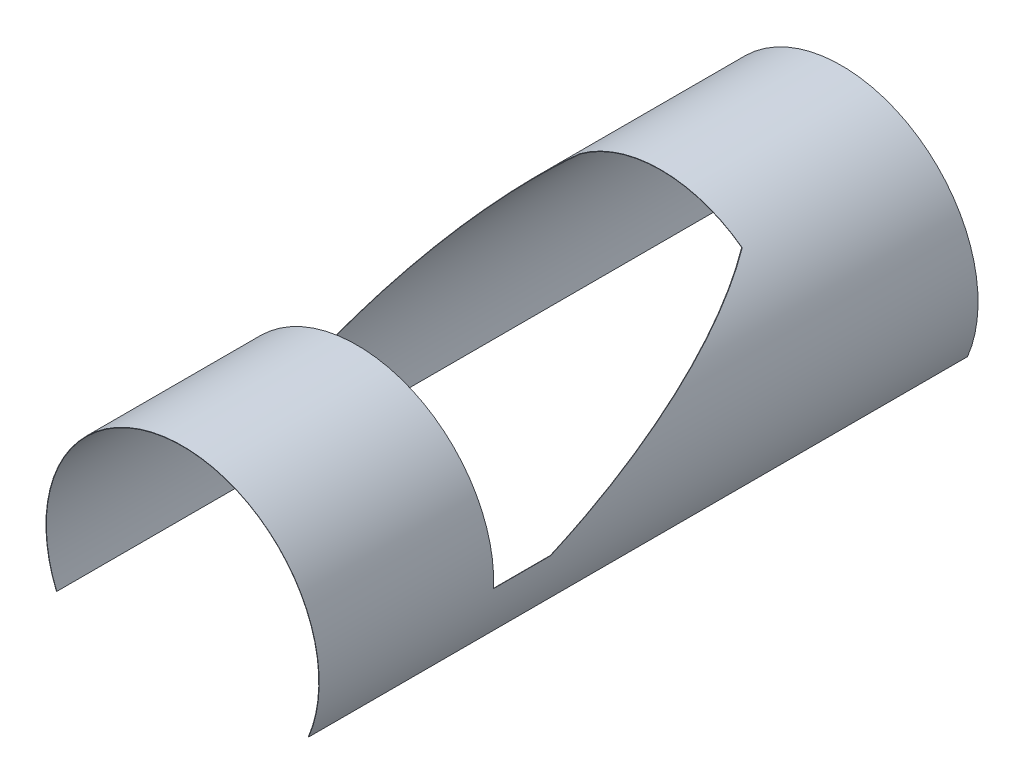
ISO-10303-21;
HEADER;
FILE_DESCRIPTION(('STEP AP214'),'2;1');
FILE_NAME('part.step','',(''),(''),'','','');
FILE_SCHEMA(('AUTOMOTIVE_DESIGN { 1 0 10303 214 1 1 1 1 }'));
ENDSEC;
DATA;
#1=APPLICATION_CONTEXT('core data for automotive mechanical design processes');
#2=APPLICATION_PROTOCOL_DEFINITION('international standard','automotive_design',2000,#1);
#3=PRODUCT_CONTEXT('',#1,'mechanical');
#4=PRODUCT('Part','Part','',(#3));
#5=PRODUCT_RELATED_PRODUCT_CATEGORY('part','',(#4));
#6=PRODUCT_DEFINITION_FORMATION('','',#4);
#7=PRODUCT_DEFINITION_CONTEXT('part definition',#1,'design');
#8=PRODUCT_DEFINITION('design','',#6,#7);
#9=PRODUCT_DEFINITION_SHAPE('','',#8);
#10=(LENGTH_UNIT() NAMED_UNIT(*) SI_UNIT(.MILLI.,.METRE.));
#11=(NAMED_UNIT(*) PLANE_ANGLE_UNIT() SI_UNIT($,.RADIAN.));
#12=(NAMED_UNIT(*) SI_UNIT($,.STERADIAN.) SOLID_ANGLE_UNIT());
#13=UNCERTAINTY_MEASURE_WITH_UNIT(LENGTH_MEASURE(1.E-05),#10,'distance_accuracy_value','');
#14=(GEOMETRIC_REPRESENTATION_CONTEXT(3) GLOBAL_UNCERTAINTY_ASSIGNED_CONTEXT((#13)) GLOBAL_UNIT_ASSIGNED_CONTEXT((#10,
#11,#12)) REPRESENTATION_CONTEXT('',''));
#15=CARTESIAN_POINT('',(0.,0.,0.));
#16=DIRECTION('',(0.,0.,1.));
#17=DIRECTION('',(1.,0.,0.));
#18=AXIS2_PLACEMENT_3D('',#15,#16,#17);
#19=CARTESIAN_POINT('',(295.859427586575,199.918755478435,-984.845733881139));
#20=DIRECTION('',(0.,0.,1.));
#21=DIRECTION('',(1.,0.,0.));
#22=AXIS2_PLACEMENT_3D('',#19,#20,#21);
#23=CYLINDRICAL_SURFACE('',#22,406.);
#24=CARTESIAN_POINT('',(295.859427586575,199.918755478435,-446.845733881188));
#25=DIRECTION('',(0.,0.,-1.));
#26=DIRECTION('',(0.,1.,0.));
#27=AXIS2_PLACEMENT_3D('',#24,#25,#26);
#28=CIRCLE('',#27,406.);
#29=CARTESIAN_POINT('',(55.1787576617254,526.887890297803,-446.845733881154));
#30=VERTEX_POINT('',#29);
#31=CARTESIAN_POINT('',(536.540097511424,526.887890297803,-446.845733881155));
#32=VERTEX_POINT('',#31);
#33=EDGE_CURVE('E165',#30,#32,#28,.T.);
#34=ORIENTED_EDGE('',*,*,#33,.F.);
#35=CARTESIAN_POINT('',(295.859427586575,199.918755478435,249.740683777524));
#36=DIRECTION('',(0.,-0.905236944073035,-0.424907137013858));
#37=DIRECTION('',(0.,-0.424907137013858,0.905236944073035));
#38=AXIS2_PLACEMENT_3D('',#35,#36,#37);
#39=ELLIPSE('',#38,955.502896122827,406.);
#40=CARTESIAN_POINT('',(-109.739990436723,181.887890297803,288.154266118872));
#41=VERTEX_POINT('',#40);
#42=EDGE_CURVE('E164',#41,#30,#39,.T.);
#43=ORIENTED_EDGE('',*,*,#42,.F.);
#44=CARTESIAN_POINT('',(295.859427586575,199.918755478435,-68731.845733872));
#45=DIRECTION('',(0.,-0.999999965876529,-0.000261241155684713));
#46=DIRECTION('',(0.,-0.000261241155684713,0.999999965876529));
#47=AXIS2_PLACEMENT_3D('',#44,#45,#46);
#48=ELLIPSE('',#47,1554119.59855971,406.);
#49=CARTESIAN_POINT('',(-109.738013715842,181.843479299821,458.154266118872));
#50=VERTEX_POINT('',#49);
#51=EDGE_CURVE('E161',#50,#41,#48,.T.);
#52=ORIENTED_EDGE('',*,*,#51,.F.);
#53=CARTESIAN_POINT('',(295.859427586575,199.918755478435,458.154266118872));
#54=DIRECTION('',(0.,0.,1.));
#55=DIRECTION('',(1.,0.,0.));
#56=AXIS2_PLACEMENT_3D('',#53,#54,#55);
#57=CIRCLE('',#56,406.);
#58=CARTESIAN_POINT('',(701.456868888991,181.843479299821,458.154266118873));
#59=VERTEX_POINT('',#58);
#60=EDGE_CURVE('E150',#59,#50,#57,.T.);
#61=ORIENTED_EDGE('',*,*,#60,.F.);
#62=CARTESIAN_POINT('',(701.458845609872,181.887890297803,288.154266118873));
#63=VERTEX_POINT('',#62);
#64=EDGE_CURVE('E158',#63,#59,#48,.T.);
#65=ORIENTED_EDGE('',*,*,#64,.F.);
#66=EDGE_CURVE('E162',#32,#63,#39,.T.);
#67=ORIENTED_EDGE('',*,*,#66,.F.);
#68=EDGE_LOOP('',(#34,#43,#52,#61,#65,#67));
#69=FACE_BOUND('',#68,.T.);
#70=CARTESIAN_POINT('',(295.859427586575,199.918755478435,978.154266118872));
#71=DIRECTION('',(0.,0.,-1.));
#72=DIRECTION('',(-1.,0.,0.));
#73=AXIS2_PLACEMENT_3D('',#70,#71,#72);
#74=CIRCLE('',#73,406.);
#75=CARTESIAN_POINT('',(-78.9354504322338,43.826476967079,978.154266118871));
#76=VERTEX_POINT('',#75);
#77=CARTESIAN_POINT('',(670.654305605383,43.8264769670795,978.154266118872));
#78=VERTEX_POINT('',#77);
#79=EDGE_CURVE('E167',#76,#78,#74,.T.);
#80=ORIENTED_EDGE('',*,*,#79,.F.);
#81=DIRECTION('',(0.,0.,1.));
#82=VECTOR('',#81,1.);
#83=CARTESIAN_POINT('',(-78.9354504322337,43.826476967079,-984.84573388114));
#84=LINE('',#83,#82);
#85=CARTESIAN_POINT('',(-78.9354504322337,43.826476967079,-984.84573388114));
#86=VERTEX_POINT('',#85);
#87=EDGE_CURVE('E72',#86,#76,#84,.T.);
#88=ORIENTED_EDGE('',*,*,#87,.F.);
#89=CARTESIAN_POINT('',(295.859427586575,199.918755478435,-984.845733881139));
#90=DIRECTION('',(0.,0.,-1.));
#91=DIRECTION('',(-1.,0.,0.));
#92=AXIS2_PLACEMENT_3D('',#89,#90,#91);
#93=CIRCLE('',#92,406.);
#94=CARTESIAN_POINT('',(670.654305605383,43.8264769670795,-984.845733881139));
#95=VERTEX_POINT('',#94);
#96=EDGE_CURVE('E168',#86,#95,#93,.T.);
#97=ORIENTED_EDGE('',*,*,#96,.T.);
#98=DIRECTION('',(0.,0.,1.));
#99=VECTOR('',#98,1.);
#100=CARTESIAN_POINT('',(670.654305605383,43.8264769670795,-984.845733881139));
#101=LINE('',#100,#99);
#102=EDGE_CURVE('E176',#95,#78,#101,.T.);
#103=ORIENTED_EDGE('',*,*,#102,.T.);
#104=EDGE_LOOP('',(#80,#88,#97,#103));
#105=FACE_BOUND('',#104,.T.);
#106=ADVANCED_FACE('F46',(#69,#105),#23,.F.);
#107=CARTESIAN_POINT('',(-78.9354504322337,43.826476967079,-984.84573388114));
#108=DIRECTION('',(-0.384463740175649,0.923140093642428,0.));
#109=DIRECTION('',(-0.923140093642428,-0.384463740175649,0.));
#110=AXIS2_PLACEMENT_3D('',#107,#108,#109);
#111=PLANE('',#110);
#112=DIRECTION('',(-0.923140093642428,-0.384463740175649,0.));
#113=VECTOR('',#112,1.);
#114=CARTESIAN_POINT('',(-78.9354504322338,43.826476967079,978.154266118871));
#115=LINE('',#114,#113);
#116=CARTESIAN_POINT('',(-79.8585905258762,43.4420132269034,978.154266118872));
#117=VERTEX_POINT('',#116);
#118=EDGE_CURVE('E170',#76,#117,#115,.T.);
#119=ORIENTED_EDGE('',*,*,#118,.T.);
#120=DIRECTION('',(0.,0.,1.));
#121=VECTOR('',#120,1.);
#122=CARTESIAN_POINT('',(-79.8585905258761,43.4420132269034,-984.845733881139));
#123=LINE('',#122,#121);
#124=CARTESIAN_POINT('',(-79.8585905258761,43.4420132269034,-984.845733881139));
#125=VERTEX_POINT('',#124);
#126=EDGE_CURVE('E186',#125,#117,#123,.T.);
#127=ORIENTED_EDGE('',*,*,#126,.F.);
#128=DIRECTION('',(-0.923140093642428,-0.384463740175649,0.));
#129=VECTOR('',#128,1.);
#130=CARTESIAN_POINT('',(-78.9354504322337,43.826476967079,-984.84573388114));
#131=LINE('',#130,#129);
#132=EDGE_CURVE('E174',#86,#125,#131,.T.);
#133=ORIENTED_EDGE('',*,*,#132,.F.);
#134=ORIENTED_EDGE('',*,*,#87,.T.);
#135=EDGE_LOOP('',(#119,#127,#133,#134));
#136=FACE_BOUND('',#135,.T.);
#137=ADVANCED_FACE('F222',(#136),#111,.F.);
#138=CARTESIAN_POINT('',(295.859427586575,199.918755478435,-984.845733881139));
#139=DIRECTION('',(0.,0.,1.));
#140=DIRECTION('',(1.,0.,0.));
#141=AXIS2_PLACEMENT_3D('',#138,#139,#140);
#142=CYLINDRICAL_SURFACE('',#141,407.);
#143=CARTESIAN_POINT('',(295.859427586575,199.918755478435,458.154266118872));
#144=DIRECTION('',(0.,0.,1.));
#145=DIRECTION('',(1.,0.,0.));
#146=AXIS2_PLACEMENT_3D('',#143,#144,#145);
#147=CIRCLE('',#146,407.);
#148=CARTESIAN_POINT('',(702.457858954757,181.843479299821,458.154266118873));
#149=VERTEX_POINT('',#148);
#150=CARTESIAN_POINT('',(-110.739003781608,181.843479299821,458.154266118872));
#151=VERTEX_POINT('',#150);
#152=EDGE_CURVE('E132',#149,#151,#147,.T.);
#153=ORIENTED_EDGE('',*,*,#152,.T.);
#154=CARTESIAN_POINT('',(295.859427586575,199.918755478435,-68731.845733872));
#155=DIRECTION('',(0.,-0.999999965876529,-0.000261241155684713));
#156=DIRECTION('',(0.,-0.000261241155684713,0.999999965876529));
#157=AXIS2_PLACEMENT_3D('',#154,#155,#156);
#158=ELLIPSE('',#157,1557947.47934434,407.);
#159=CARTESIAN_POINT('',(-110.740975636096,181.887890297803,288.154266118872));
#160=VERTEX_POINT('',#159);
#161=EDGE_CURVE('E13',#151,#160,#158,.T.);
#162=ORIENTED_EDGE('',*,*,#161,.T.);
#163=CARTESIAN_POINT('',(295.859427586575,199.918755478435,249.740683777524));
#164=DIRECTION('',(0.,-0.905236944073035,-0.424907137013858));
#165=DIRECTION('',(0.,-0.424907137013858,0.905236944073035));
#166=AXIS2_PLACEMENT_3D('',#163,#164,#165);
#167=ELLIPSE('',#166,957.856351531997,407.);
#168=CARTESIAN_POINT('',(53.4956826174184,526.887890297803,-446.845733881154));
#169=VERTEX_POINT('',#168);
#170=EDGE_CURVE('E54',#160,#169,#167,.T.);
#171=ORIENTED_EDGE('',*,*,#170,.T.);
#172=CARTESIAN_POINT('',(295.859427586575,199.918755478435,-446.845733881188));
#173=DIRECTION('',(0.,0.,-1.));
#174=DIRECTION('',(0.,1.,0.));
#175=AXIS2_PLACEMENT_3D('',#172,#173,#174);
#176=CIRCLE('',#175,407.);
#177=CARTESIAN_POINT('',(538.223172555731,526.887890297803,-446.845733881155));
#178=VERTEX_POINT('',#177);
#179=EDGE_CURVE('E49',#169,#178,#176,.T.);
#180=ORIENTED_EDGE('',*,*,#179,.T.);
#181=CARTESIAN_POINT('',(702.459830809245,181.887890297803,288.154266118873));
#182=VERTEX_POINT('',#181);
#183=EDGE_CURVE('E192',#178,#182,#167,.T.);
#184=ORIENTED_EDGE('',*,*,#183,.T.);
#185=EDGE_CURVE('E56',#182,#149,#158,.T.);
#186=ORIENTED_EDGE('',*,*,#185,.T.);
#187=EDGE_LOOP('',(#153,#162,#171,#180,#184,#186));
#188=FACE_BOUND('',#187,.T.);
#189=CARTESIAN_POINT('',(295.859427586575,199.918755478435,978.154266118872));
#190=DIRECTION('',(0.,0.,1.));
#191=DIRECTION('',(1.,0.,0.));
#192=AXIS2_PLACEMENT_3D('',#189,#190,#191);
#193=CIRCLE('',#192,407.);
#194=CARTESIAN_POINT('',(671.577445699025,43.4420132269036,978.154266118872));
#195=VERTEX_POINT('',#194);
#196=EDGE_CURVE('E182',#117,#195,#193,.F.);
#197=ORIENTED_EDGE('',*,*,#196,.T.);
#198=DIRECTION('',(0.,0.,1.));
#199=VECTOR('',#198,1.);
#200=CARTESIAN_POINT('',(671.577445699025,43.4420132269036,-984.845733881139));
#201=LINE('',#200,#199);
#202=CARTESIAN_POINT('',(671.577445699025,43.4420132269036,-984.845733881139));
#203=VERTEX_POINT('',#202);
#204=EDGE_CURVE('E189',#203,#195,#201,.T.);
#205=ORIENTED_EDGE('',*,*,#204,.F.);
#206=CARTESIAN_POINT('',(295.859427586575,199.918755478435,-984.845733881139));
#207=DIRECTION('',(0.,0.,1.));
#208=DIRECTION('',(1.,0.,0.));
#209=AXIS2_PLACEMENT_3D('',#206,#207,#208);
#210=CIRCLE('',#209,407.);
#211=EDGE_CURVE('E172',#125,#203,#210,.F.);
#212=ORIENTED_EDGE('',*,*,#211,.F.);
#213=ORIENTED_EDGE('',*,*,#126,.T.);
#214=EDGE_LOOP('',(#197,#205,#212,#213));
#215=FACE_BOUND('',#214,.T.);
#216=ADVANCED_FACE('F134',(#188,#215),#142,.T.);
#217=CARTESIAN_POINT('',(671.577445699025,43.4420132269036,-984.845733881139));
#218=DIRECTION('',(0.384463740175921,0.923140093642315,0.));
#219=DIRECTION('',(-0.923140093642315,0.384463740175921,0.));
#220=AXIS2_PLACEMENT_3D('',#217,#218,#219);
#221=PLANE('',#220);
#222=DIRECTION('',(-0.923140093642315,0.384463740175921,0.));
#223=VECTOR('',#222,1.);
#224=CARTESIAN_POINT('',(671.577445699025,43.4420132269036,978.154266118872));
#225=LINE('',#224,#223);
#226=EDGE_CURVE('E179',#195,#78,#225,.T.);
#227=ORIENTED_EDGE('',*,*,#226,.T.);
#228=ORIENTED_EDGE('',*,*,#102,.F.);
#229=DIRECTION('',(-0.923140093642315,0.384463740175921,0.));
#230=VECTOR('',#229,1.);
#231=CARTESIAN_POINT('',(671.577445699025,43.4420132269036,-984.845733881139));
#232=LINE('',#231,#230);
#233=EDGE_CURVE('E98',#203,#95,#232,.T.);
#234=ORIENTED_EDGE('',*,*,#233,.F.);
#235=ORIENTED_EDGE('',*,*,#204,.T.);
#236=EDGE_LOOP('',(#227,#228,#234,#235));
#237=FACE_BOUND('',#236,.T.);
#238=ADVANCED_FACE('F230',(#237),#221,.F.);
#239=CARTESIAN_POINT('',(295.859427586575,199.918755478435,-984.845733881139));
#240=DIRECTION('',(0.,0.,-1.));
#241=DIRECTION('',(-1.,0.,0.));
#242=AXIS2_PLACEMENT_3D('',#239,#240,#241);
#243=PLANE('',#242);
#244=ORIENTED_EDGE('',*,*,#96,.F.);
#245=ORIENTED_EDGE('',*,*,#132,.T.);
#246=ORIENTED_EDGE('',*,*,#211,.T.);
#247=ORIENTED_EDGE('',*,*,#233,.T.);
#248=EDGE_LOOP('',(#244,#245,#246,#247));
#249=FACE_BOUND('',#248,.T.);
#250=ADVANCED_FACE('F236',(#249),#243,.T.);
#251=CARTESIAN_POINT('',(295.859427586575,199.918755478435,978.154266118872));
#252=DIRECTION('',(0.,0.,-1.));
#253=DIRECTION('',(-1.,0.,0.));
#254=AXIS2_PLACEMENT_3D('',#251,#252,#253);
#255=PLANE('',#254);
#256=ORIENTED_EDGE('',*,*,#79,.T.);
#257=ORIENTED_EDGE('',*,*,#226,.F.);
#258=ORIENTED_EDGE('',*,*,#196,.F.);
#259=ORIENTED_EDGE('',*,*,#118,.F.);
#260=EDGE_LOOP('',(#256,#257,#258,#259));
#261=FACE_BOUND('',#260,.T.);
#262=ADVANCED_FACE('F233',(#261),#255,.F.);
#263=CARTESIAN_POINT('',(-111.140572413426,792.48106411812,-446.845733881139));
#264=DIRECTION('',(0.,0.,-1.));
#265=DIRECTION('',(0.,1.,0.));
#266=AXIS2_PLACEMENT_3D('',#263,#264,#265);
#267=PLANE('',#266);
#268=ORIENTED_EDGE('',*,*,#33,.T.);
#269=DIRECTION('',(1.,0.,0.));
#270=VECTOR('',#269,1.);
#271=CARTESIAN_POINT('',(-111.140572413426,526.887890297803,-446.845733881155));
#272=LINE('',#271,#270);
#273=EDGE_CURVE('E201',#32,#178,#272,.T.);
#274=ORIENTED_EDGE('',*,*,#273,.T.);
#275=ORIENTED_EDGE('',*,*,#179,.F.);
#276=EDGE_CURVE('E159',#169,#30,#272,.T.);
#277=ORIENTED_EDGE('',*,*,#276,.T.);
#278=EDGE_LOOP('',(#268,#274,#275,#277));
#279=FACE_BOUND('',#278,.T.);
#280=ADVANCED_FACE('F204',(#279),#267,.F.);
#281=CARTESIAN_POINT('',(-111.140572413426,181.887890297803,288.154266118872));
#282=DIRECTION('',(0.,-0.905236944073035,-0.424907137013858));
#283=DIRECTION('',(0.,0.424907137013858,-0.905236944073035));
#284=AXIS2_PLACEMENT_3D('',#281,#282,#283);
#285=PLANE('',#284);
#286=ORIENTED_EDGE('',*,*,#42,.T.);
#287=ORIENTED_EDGE('',*,*,#276,.F.);
#288=ORIENTED_EDGE('',*,*,#170,.F.);
#289=DIRECTION('',(1.,0.,0.));
#290=VECTOR('',#289,1.);
#291=CARTESIAN_POINT('',(-111.140572413426,181.887890297803,288.154266118872));
#292=LINE('',#291,#290);
#293=EDGE_CURVE('E147',#160,#41,#292,.T.);
#294=ORIENTED_EDGE('',*,*,#293,.T.);
#295=EDGE_LOOP('',(#286,#287,#288,#294));
#296=FACE_BOUND('',#295,.T.);
#297=ADVANCED_FACE('F196',(#296),#285,.F.);
#298=ORIENTED_EDGE('',*,*,#66,.T.);
#299=EDGE_CURVE('E151',#63,#182,#292,.T.);
#300=ORIENTED_EDGE('',*,*,#299,.T.);
#301=ORIENTED_EDGE('',*,*,#183,.F.);
#302=ORIENTED_EDGE('',*,*,#273,.F.);
#303=EDGE_LOOP('',(#298,#300,#301,#302));
#304=FACE_BOUND('',#303,.T.);
#305=ADVANCED_FACE('F207',(#304),#285,.F.);
#306=CARTESIAN_POINT('',(-111.140572413426,181.843479299821,458.154266118872));
#307=DIRECTION('',(0.,-0.999999965876529,-0.000261241155684713));
#308=DIRECTION('',(0.,0.000261241155684713,-0.999999965876529));
#309=AXIS2_PLACEMENT_3D('',#306,#307,#308);
#310=PLANE('',#309);
#311=ORIENTED_EDGE('',*,*,#51,.T.);
#312=ORIENTED_EDGE('',*,*,#293,.F.);
#313=ORIENTED_EDGE('',*,*,#161,.F.);
#314=DIRECTION('',(1.,0.,0.));
#315=VECTOR('',#314,1.);
#316=CARTESIAN_POINT('',(-111.140572413426,181.843479299821,458.154266118872));
#317=LINE('',#316,#315);
#318=EDGE_CURVE('E144',#151,#50,#317,.T.);
#319=ORIENTED_EDGE('',*,*,#318,.T.);
#320=EDGE_LOOP('',(#311,#312,#313,#319));
#321=FACE_BOUND('',#320,.T.);
#322=ADVANCED_FACE('F143',(#321),#310,.F.);
#323=ORIENTED_EDGE('',*,*,#64,.T.);
#324=EDGE_CURVE('E63',#59,#149,#317,.T.);
#325=ORIENTED_EDGE('',*,*,#324,.T.);
#326=ORIENTED_EDGE('',*,*,#185,.F.);
#327=ORIENTED_EDGE('',*,*,#299,.F.);
#328=EDGE_LOOP('',(#323,#325,#326,#327));
#329=FACE_BOUND('',#328,.T.);
#330=ADVANCED_FACE('F212',(#329),#310,.F.);
#331=CARTESIAN_POINT('',(-111.140572413426,606.887890297803,458.154266118872));
#332=DIRECTION('',(0.,0.,1.));
#333=DIRECTION('',(1.,0.,0.));
#334=AXIS2_PLACEMENT_3D('',#331,#332,#333);
#335=PLANE('',#334);
#336=ORIENTED_EDGE('',*,*,#60,.T.);
#337=ORIENTED_EDGE('',*,*,#318,.F.);
#338=ORIENTED_EDGE('',*,*,#152,.F.);
#339=ORIENTED_EDGE('',*,*,#324,.F.);
#340=EDGE_LOOP('',(#336,#337,#338,#339));
#341=FACE_BOUND('',#340,.T.);
#342=ADVANCED_FACE('F148',(#341),#335,.F.);
#343=CLOSED_SHELL('',(#106,#137,#216,#238,#250,#262,#280,#297,#305,#322,#330,#342));
#344=MANIFOLD_SOLID_BREP('B2',#343);
#345=ADVANCED_BREP_SHAPE_REPRESENTATION('',(#18,#344),#14);
#346=SHAPE_DEFINITION_REPRESENTATION(#9,#345);
ENDSEC;
END-ISO-10303-21;
